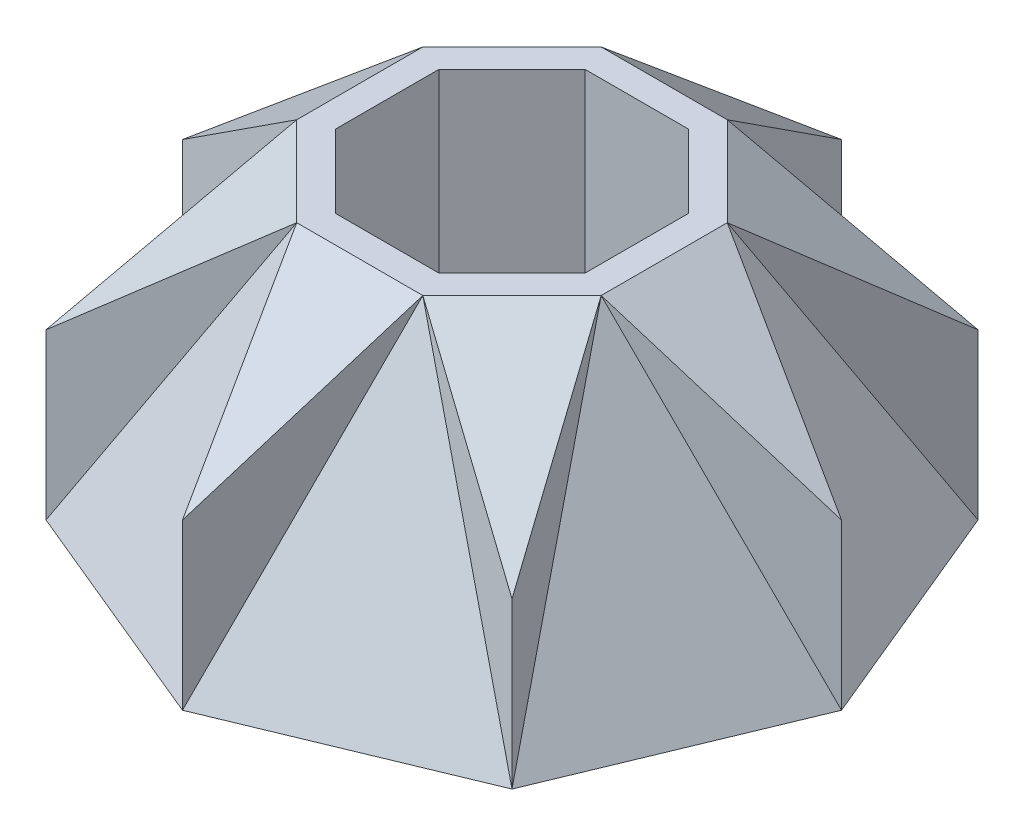
ISO-10303-21;
HEADER;
FILE_DESCRIPTION(('STEP AP214'),'2;1');
FILE_NAME('part.step','',(''),(''),'','','');
FILE_SCHEMA(('AUTOMOTIVE_DESIGN { 1 0 10303 214 1 1 1 1 }'));
ENDSEC;
DATA;
#1=APPLICATION_CONTEXT('core data for automotive mechanical design processes');
#2=APPLICATION_PROTOCOL_DEFINITION('international standard','automotive_design',2000,#1);
#3=PRODUCT_CONTEXT('',#1,'mechanical');
#4=PRODUCT('Part','Part','',(#3));
#5=PRODUCT_RELATED_PRODUCT_CATEGORY('part','',(#4));
#6=PRODUCT_DEFINITION_FORMATION('','',#4);
#7=PRODUCT_DEFINITION_CONTEXT('part definition',#1,'design');
#8=PRODUCT_DEFINITION('design','',#6,#7);
#9=PRODUCT_DEFINITION_SHAPE('','',#8);
#10=(LENGTH_UNIT() NAMED_UNIT(*) SI_UNIT(.MILLI.,.METRE.));
#11=(NAMED_UNIT(*) PLANE_ANGLE_UNIT() SI_UNIT($,.RADIAN.));
#12=(NAMED_UNIT(*) SI_UNIT($,.STERADIAN.) SOLID_ANGLE_UNIT());
#13=UNCERTAINTY_MEASURE_WITH_UNIT(LENGTH_MEASURE(1.E-05),#10,'distance_accuracy_value','');
#14=(GEOMETRIC_REPRESENTATION_CONTEXT(3) GLOBAL_UNCERTAINTY_ASSIGNED_CONTEXT((#13)) GLOBAL_UNIT_ASSIGNED_CONTEXT((#10,
#11,#12)) REPRESENTATION_CONTEXT('',''));
#15=CARTESIAN_POINT('',(0.,0.,0.));
#16=DIRECTION('',(0.,0.,1.));
#17=DIRECTION('',(1.,0.,0.));
#18=AXIS2_PLACEMENT_3D('',#15,#16,#17);
#19=CARTESIAN_POINT('',(0.,55.,0.));
#20=DIRECTION('',(0.,1.,0.));
#21=DIRECTION('',(0.,0.,1.));
#22=AXIS2_PLACEMENT_3D('',#19,#20,#21);
#23=PLANE('',#22);
#24=DIRECTION('',(0.707106781186548,0.,-0.707106781186547));
#25=VECTOR('',#24,1.);
#26=CARTESIAN_POINT('',(9.40943515908719,55.,22.7163859753386));
#27=LINE('',#26,#25);
#28=CARTESIAN_POINT('',(9.40943515908719,55.,22.7163859753386));
#29=VERTEX_POINT('',#28);
#30=CARTESIAN_POINT('',(22.7163859753386,55.,9.4094351590872));
#31=VERTEX_POINT('',#30);
#32=EDGE_CURVE('E78',#29,#31,#27,.T.);
#33=ORIENTED_EDGE('',*,*,#32,.F.);
#34=DIRECTION('',(1.,0.,0.));
#35=VECTOR('',#34,1.);
#36=CARTESIAN_POINT('',(-9.40943515908736,55.,22.7163859753385));
#37=LINE('',#36,#35);
#38=CARTESIAN_POINT('',(-9.40943515908736,55.,22.7163859753385));
#39=VERTEX_POINT('',#38);
#40=EDGE_CURVE('E240',#39,#29,#37,.T.);
#41=ORIENTED_EDGE('',*,*,#40,.F.);
#42=DIRECTION('',(0.707106781186545,0.,0.70710678118655));
#43=VECTOR('',#42,1.);
#44=CARTESIAN_POINT('',(-22.7163859753386,55.,9.40943515908719));
#45=LINE('',#44,#43);
#46=CARTESIAN_POINT('',(-22.7163859753386,55.,9.40943515908719));
#47=VERTEX_POINT('',#46);
#48=EDGE_CURVE('E236',#47,#39,#45,.T.);
#49=ORIENTED_EDGE('',*,*,#48,.F.);
#50=DIRECTION('',(0.,0.,1.));
#51=VECTOR('',#50,1.);
#52=CARTESIAN_POINT('',(-22.7163859753386,55.,-9.40943515908727));
#53=LINE('',#52,#51);
#54=CARTESIAN_POINT('',(-22.7163859753386,55.,-9.40943515908727));
#55=VERTEX_POINT('',#54);
#56=EDGE_CURVE('E232',#55,#47,#53,.T.);
#57=ORIENTED_EDGE('',*,*,#56,.F.);
#58=DIRECTION('',(-0.707106781186553,0.,0.707106781186542));
#59=VECTOR('',#58,1.);
#60=CARTESIAN_POINT('',(-9.40943515908701,55.,-22.7163859753387));
#61=LINE('',#60,#59);
#62=CARTESIAN_POINT('',(-9.40943515908701,55.,-22.7163859753387));
#63=VERTEX_POINT('',#62);
#64=EDGE_CURVE('E225',#63,#55,#61,.T.);
#65=ORIENTED_EDGE('',*,*,#64,.F.);
#66=DIRECTION('',(-1.,0.,0.));
#67=VECTOR('',#66,1.);
#68=CARTESIAN_POINT('',(9.40943515908748,55.,-22.7163859753385));
#69=LINE('',#68,#67);
#70=CARTESIAN_POINT('',(9.40943515908748,55.,-22.7163859753385));
#71=VERTEX_POINT('',#70);
#72=EDGE_CURVE('E221',#71,#63,#69,.T.);
#73=ORIENTED_EDGE('',*,*,#72,.F.);
#74=DIRECTION('',(-0.707106781186539,0.,-0.707106781186556));
#75=VECTOR('',#74,1.);
#76=CARTESIAN_POINT('',(22.7163859753387,55.,-9.40943515908693));
#77=LINE('',#76,#75);
#78=CARTESIAN_POINT('',(22.7163859753387,55.,-9.40943515908693));
#79=VERTEX_POINT('',#78);
#80=EDGE_CURVE('E203',#79,#71,#77,.T.);
#81=ORIENTED_EDGE('',*,*,#80,.F.);
#82=DIRECTION('',(0.,0.,-1.));
#83=VECTOR('',#82,1.);
#84=CARTESIAN_POINT('',(22.7163859753386,55.,9.4094351590872));
#85=LINE('',#84,#83);
#86=EDGE_CURVE('E213',#31,#79,#85,.T.);
#87=ORIENTED_EDGE('',*,*,#86,.F.);
#88=EDGE_LOOP('',(#33,#41,#49,#57,#65,#73,#81,#87));
#89=FACE_BOUND('',#88,.T.);
#90=DIRECTION('',(0.,0.,-1.));
#91=VECTOR('',#90,1.);
#92=CARTESIAN_POINT('',(27.7163859753386,55.,278.893546026037));
#93=LINE('',#92,#91);
#94=CARTESIAN_POINT('',(27.7163859753386,55.,11.4805029709527));
#95=VERTEX_POINT('',#94);
#96=CARTESIAN_POINT('',(27.7163859753387,55.,-11.4805029709524));
#97=VERTEX_POINT('',#96);
#98=EDGE_CURVE('E513',#95,#97,#93,.T.);
#99=ORIENTED_EDGE('',*,*,#98,.T.);
#100=DIRECTION('',(-0.707106781186539,0.,-0.707106781186556));
#101=VECTOR('',#100,1.);
#102=CARTESIAN_POINT('',(232.338970686308,55.,193.142081740021));
#103=LINE('',#102,#101);
#104=CARTESIAN_POINT('',(11.480502970953,55.,-27.7163859753385));
#105=VERTEX_POINT('',#104);
#106=EDGE_CURVE('E247',#97,#105,#103,.T.);
#107=ORIENTED_EDGE('',*,*,#106,.T.);
#108=DIRECTION('',(-1.,0.,0.));
#109=VECTOR('',#108,1.);
#110=CARTESIAN_POINT('',(300.860537437046,55.,-27.7163859753354));
#111=LINE('',#110,#109);
#112=CARTESIAN_POINT('',(-11.4805029709524,55.,-27.7163859753387));
#113=VERTEX_POINT('',#112);
#114=EDGE_CURVE('E279',#105,#113,#111,.T.);
#115=ORIENTED_EDGE('',*,*,#114,.T.);
#116=DIRECTION('',(-0.707106781186554,0.,0.707106781186541));
#117=VECTOR('',#116,1.);
#118=CARTESIAN_POINT('',(193.142081740021,55.,-232.338970686308));
#119=LINE('',#118,#117);
#120=CARTESIAN_POINT('',(-27.7163859753387,55.,-11.4805029709528));
#121=VERTEX_POINT('',#120);
#122=EDGE_CURVE('E297',#113,#121,#119,.T.);
#123=ORIENTED_EDGE('',*,*,#122,.T.);
#124=DIRECTION('',(0.,0.,1.));
#125=VECTOR('',#124,1.);
#126=CARTESIAN_POINT('',(-27.7163859753386,55.,-300.860537437046));
#127=LINE('',#126,#125);
#128=CARTESIAN_POINT('',(-27.7163859753386,55.,11.4805029709527));
#129=VERTEX_POINT('',#128);
#130=EDGE_CURVE('E315',#121,#129,#127,.T.);
#131=ORIENTED_EDGE('',*,*,#130,.T.);
#132=DIRECTION('',(0.707106781186544,0.,0.707106781186551));
#133=VECTOR('',#132,1.);
#134=CARTESIAN_POINT('',(-232.338970686309,55.,-193.14208174002));
#135=LINE('',#134,#133);
#136=CARTESIAN_POINT('',(-11.4805029709529,55.,27.7163859753385));
#137=VERTEX_POINT('',#136);
#138=EDGE_CURVE('E333',#129,#137,#135,.T.);
#139=ORIENTED_EDGE('',*,*,#138,.T.);
#140=DIRECTION('',(1.,0.,0.));
#141=VECTOR('',#140,1.);
#142=CARTESIAN_POINT('',(-300.860537437046,55.,27.7163859753375));
#143=LINE('',#142,#141);
#144=CARTESIAN_POINT('',(11.4805029709527,55.,27.7163859753386));
#145=VERTEX_POINT('',#144);
#146=EDGE_CURVE('E351',#137,#145,#143,.T.);
#147=ORIENTED_EDGE('',*,*,#146,.T.);
#148=DIRECTION('',(0.707106781186549,0.,-0.707106781186546));
#149=VECTOR('',#148,1.);
#150=CARTESIAN_POINT('',(-193.142081740019,55.,232.33897068631));
#151=LINE('',#150,#149);
#152=EDGE_CURVE('E369',#145,#95,#151,.T.);
#153=ORIENTED_EDGE('',*,*,#152,.T.);
#154=EDGE_LOOP('',(#99,#107,#115,#123,#131,#139,#147,#153));
#155=FACE_BOUND('',#154,.T.);
#156=ADVANCED_FACE('F61',(#89,#155),#23,.T.);
#157=CARTESIAN_POINT('',(11.480502970953,-0.002000000000002,-27.7163859753385));
#158=DIRECTION('',(-0.429311983438382,0.,-0.903156254961566));
#159=DIRECTION('',(-0.903156254961566,0.,0.429311983438382));
#160=AXIS2_PLACEMENT_3D('',#157,#158,#159);
#161=PLANE('',#160);
#162=DIRECTION('',(0.477560604595581,-0.848766070541332,-0.227006666060998));
#163=VECTOR('',#162,1.);
#164=CARTESIAN_POINT('',(33.774861724865,15.3763478546955,-38.3139269031108));
#165=LINE('',#164,#163);
#166=CARTESIAN_POINT('',(42.4264068711934,4.07746753028349E-12,-42.4264068711923));
#167=VERTEX_POINT('',#166);
#168=EDGE_CURVE('E403',#105,#167,#165,.T.);
#169=ORIENTED_EDGE('',*,*,#168,.F.);
#170=DIRECTION('',(0.729597815885047,-0.58941388352804,-0.346811621720154));
#171=VECTOR('',#170,1.);
#172=CARTESIAN_POINT('',(35.1332925552082,35.8918252472895,-38.9596519710984));
#173=LINE('',#172,#171);
#174=CARTESIAN_POINT('',(42.4264068711934,30.,-42.4264068711923));
#175=VERTEX_POINT('',#174);
#176=EDGE_CURVE('E273',#105,#175,#173,.T.);
#177=ORIENTED_EDGE('',*,*,#176,.T.);
#178=DIRECTION('',(0.,1.,0.));
#179=VECTOR('',#178,1.);
#180=CARTESIAN_POINT('',(42.4264068711934,-0.002000000000002,-42.4264068711923));
#181=LINE('',#180,#179);
#182=EDGE_CURVE('E387',#167,#175,#181,.T.);
#183=ORIENTED_EDGE('',*,*,#182,.F.);
#184=EDGE_LOOP('',(#169,#177,#183));
#185=FACE_BOUND('',#184,.T.);
#186=ADVANCED_FACE('F675',(#185),#161,.T.);
#187=CARTESIAN_POINT('',(42.4264068711934,-0.002000000000002,-42.4264068711923));
#188=DIRECTION('',(0.903156254961556,0.,0.429311983438405));
#189=DIRECTION('',(0.429311983438405,0.,-0.903156254961556));
#190=AXIS2_PLACEMENT_3D('',#187,#188,#189);
#191=PLANE('',#190);
#192=ORIENTED_EDGE('',*,*,#182,.T.);
#193=DIRECTION('',(-0.346811621720172,0.58941388352804,0.729597815885038));
#194=VECTOR('',#193,1.);
#195=CARTESIAN_POINT('',(48.5592832466853,19.5770433996796,-55.3283194035878));
#196=LINE('',#195,#194);
#197=EDGE_CURVE('E269',#175,#97,#196,.T.);
#198=ORIENTED_EDGE('',*,*,#197,.T.);
#199=DIRECTION('',(-0.227006666061007,0.848766070541338,0.477560604595568));
#200=VECTOR('',#199,1.);
#201=CARTESIAN_POINT('',(42.4267922223051,-0.0014408076851852,-42.4272175456677));
#202=LINE('',#201,#200);
#203=EDGE_CURVE('E395',#167,#97,#202,.T.);
#204=ORIENTED_EDGE('',*,*,#203,.F.);
#205=EDGE_LOOP('',(#192,#198,#204));
#206=FACE_BOUND('',#205,.T.);
#207=ADVANCED_FACE('F733',(#206),#191,.T.);
#208=CARTESIAN_POINT('',(-11.4805029709524,-0.002000000000002,-27.7163859753387));
#209=DIRECTION('',(-0.942197327088298,0.,-0.335058497620442));
#210=DIRECTION('',(-0.335058497620442,0.,0.942197327088298));
#211=AXIS2_PLACEMENT_3D('',#208,#209,#210);
#212=PLANE('',#211);
#213=DIRECTION('',(0.1771683889908,-0.848766070541333,-0.498204294883365));
#214=VECTOR('',#213,1.);
#215=CARTESIAN_POINT('',(-3.20960376778544,15.3763478546954,-50.9744712863654));
#216=LINE('',#215,#214);
#217=CARTESIAN_POINT('',(6.39209206167128E-13,3.41480316246034E-12,-60.));
#218=VERTEX_POINT('',#217);
#219=EDGE_CURVE('E421',#113,#218,#216,.T.);
#220=ORIENTED_EDGE('',*,*,#219,.F.);
#221=DIRECTION('',(0.270670713638586,-0.58941388352804,-0.761136412663836));
#222=VECTOR('',#221,1.);
#223=CARTESIAN_POINT('',(-2.70564469023309,35.8918252472895,-52.3916235126301));
#224=LINE('',#223,#222);
#225=CARTESIAN_POINT('',(6.22765727875674E-13,30.,-60.));
#226=VERTEX_POINT('',#225);
#227=EDGE_CURVE('E291',#113,#226,#224,.T.);
#228=ORIENTED_EDGE('',*,*,#227,.T.);
#229=DIRECTION('',(0.,1.,0.));
#230=VECTOR('',#229,1.);
#231=CARTESIAN_POINT('',(6.39209206167128E-13,-0.002000000000002,-60.));
#232=LINE('',#231,#230);
#233=EDGE_CURVE('E407',#218,#226,#232,.T.);
#234=ORIENTED_EDGE('',*,*,#233,.F.);
#235=EDGE_LOOP('',(#220,#228,#234));
#236=FACE_BOUND('',#235,.T.);
#237=ADVANCED_FACE('F730',(#236),#212,.T.);
#238=CARTESIAN_POINT('',(6.39209206167128E-13,-0.002000000000002,-60.));
#239=DIRECTION('',(0.942197327088305,0.,-0.335058497620421));
#240=DIRECTION('',(-0.335058497620421,0.,-0.942197327088305));
#241=AXIS2_PLACEMENT_3D('',#238,#239,#240);
#242=PLANE('',#241);
#243=ORIENTED_EDGE('',*,*,#233,.T.);
#244=DIRECTION('',(0.270670713638569,0.58941388352804,0.761136412663842));
#245=VECTOR('',#244,1.);
#246=CARTESIAN_POINT('',(-4.78643136864277,19.5770433996796,-73.4596283152216));
#247=LINE('',#246,#245);
#248=EDGE_CURVE('E287',#226,#105,#247,.T.);
#249=ORIENTED_EDGE('',*,*,#248,.T.);
#250=DIRECTION('',(0.177168388990786,0.848766070541337,0.498204294883361));
#251=VECTOR('',#250,1.);
#252=CARTESIAN_POINT('',(-0.000300749033970873,-0.00144080768516555,-60.0008457178031));
#253=LINE('',#252,#251);
#254=EDGE_CURVE('E413',#218,#105,#253,.T.);
#255=ORIENTED_EDGE('',*,*,#254,.F.);
#256=EDGE_LOOP('',(#243,#249,#255));
#257=FACE_BOUND('',#256,.T.);
#258=ADVANCED_FACE('F725',(#257),#242,.T.);
#259=CARTESIAN_POINT('',(-27.7163859753385,-0.002000000000002,-11.4805029709529));
#260=DIRECTION('',(-0.903156254961565,0.,0.429311983438386));
#261=DIRECTION('',(0.429311983438385,0.,0.903156254961565));
#262=AXIS2_PLACEMENT_3D('',#259,#260,#261);
#263=PLANE('',#262);
#264=DIRECTION('',(-0.227006666060999,-0.848766070541333,-0.477560604595579));
#265=VECTOR('',#264,1.);
#266=CARTESIAN_POINT('',(-38.3139269031109,15.3763478546954,-33.7748617248649));
#267=LINE('',#266,#265);
#268=CARTESIAN_POINT('',(-42.4264068711925,2.30978430826312E-12,-42.4264068711932));
#269=VERTEX_POINT('',#268);
#270=EDGE_CURVE('E439',#121,#269,#267,.T.);
#271=ORIENTED_EDGE('',*,*,#270,.F.);
#272=DIRECTION('',(-0.346811621720156,-0.58941388352804,-0.729597815885046));
#273=VECTOR('',#272,1.);
#274=CARTESIAN_POINT('',(-38.9596519710985,35.8918252472895,-35.133292555208));
#275=LINE('',#274,#273);
#276=CARTESIAN_POINT('',(-42.4264068711925,30.,-42.4264068711932));
#277=VERTEX_POINT('',#276);
#278=EDGE_CURVE('E309',#121,#277,#275,.T.);
#279=ORIENTED_EDGE('',*,*,#278,.T.);
#280=DIRECTION('',(0.,1.,0.));
#281=VECTOR('',#280,1.);
#282=CARTESIAN_POINT('',(-42.4264068711925,-0.002000000000002,-42.4264068711932));
#283=LINE('',#282,#281);
#284=EDGE_CURVE('E425',#269,#277,#283,.T.);
#285=ORIENTED_EDGE('',*,*,#284,.F.);
#286=EDGE_LOOP('',(#271,#279,#285));
#287=FACE_BOUND('',#286,.T.);
#288=ADVANCED_FACE('F722',(#287),#263,.T.);
#289=CARTESIAN_POINT('',(-42.4264068711925,-0.002000000000002,-42.4264068711932));
#290=DIRECTION('',(0.429311983438402,0.,-0.903156254961557));
#291=DIRECTION('',(-0.903156254961557,0.,-0.429311983438402));
#292=AXIS2_PLACEMENT_3D('',#289,#290,#291);
#293=PLANE('',#292);
#294=ORIENTED_EDGE('',*,*,#284,.T.);
#295=DIRECTION('',(0.72959781588504,0.58941388352804,0.34681162172017));
#296=VECTOR('',#295,1.);
#297=CARTESIAN_POINT('',(-55.3283194035879,19.5770433996796,-48.5592832466851));
#298=LINE('',#297,#296);
#299=EDGE_CURVE('E305',#277,#113,#298,.T.);
#300=ORIENTED_EDGE('',*,*,#299,.T.);
#301=DIRECTION('',(0.477560604595569,0.848766070541337,0.227006666061005));
#302=VECTOR('',#301,1.);
#303=CARTESIAN_POINT('',(-42.4272175456679,-0.00144080768515214,-42.426792222305));
#304=LINE('',#303,#302);
#305=EDGE_CURVE('E431',#269,#113,#304,.T.);
#306=ORIENTED_EDGE('',*,*,#305,.F.);
#307=EDGE_LOOP('',(#294,#300,#306));
#308=FACE_BOUND('',#307,.T.);
#309=ADVANCED_FACE('F717',(#308),#293,.T.);
#310=CARTESIAN_POINT('',(-27.7163859753386,-0.002000000000002,11.4805029709527));
#311=DIRECTION('',(-0.335058497620432,0.,0.942197327088301));
#312=DIRECTION('',(0.942197327088301,0.,0.335058497620432));
#313=AXIS2_PLACEMENT_3D('',#310,#311,#312);
#314=PLANE('',#313);
#315=DIRECTION('',(-0.498204294883363,-0.848766070541335,-0.177168388990794));
#316=VECTOR('',#315,1.);
#317=CARTESIAN_POINT('',(-50.9744712863653,15.3763478546952,3.209603767786));
#318=LINE('',#317,#316);
#319=CARTESIAN_POINT('',(-60.,1.60461921527855E-13,0.));
#320=VERTEX_POINT('',#319);
#321=EDGE_CURVE('E457',#129,#320,#318,.T.);
#322=ORIENTED_EDGE('',*,*,#321,.F.);
#323=DIRECTION('',(-0.761136412663839,-0.58941388352804,-0.270670713638577));
#324=VECTOR('',#323,1.);
#325=CARTESIAN_POINT('',(-52.39162351263,35.8918252472895,2.70564469023364));
#326=LINE('',#325,#324);
#327=CARTESIAN_POINT('',(-60.,30.,0.));
#328=VERTEX_POINT('',#327);
#329=EDGE_CURVE('E327',#129,#328,#326,.T.);
#330=ORIENTED_EDGE('',*,*,#329,.T.);
#331=DIRECTION('',(0.,1.,0.));
#332=VECTOR('',#331,1.);
#333=CARTESIAN_POINT('',(-60.,-0.002000000000002,0.));
#334=LINE('',#333,#332);
#335=EDGE_CURVE('E443',#320,#328,#334,.T.);
#336=ORIENTED_EDGE('',*,*,#335,.F.);
#337=EDGE_LOOP('',(#322,#330,#336));
#338=FACE_BOUND('',#337,.T.);
#339=ADVANCED_FACE('F714',(#338),#314,.T.);
#340=CARTESIAN_POINT('',(-60.,-0.002000000000002,0.));
#341=DIRECTION('',(-0.33505849762043,0.,-0.942197327088302));
#342=DIRECTION('',(-0.942197327088302,0.,0.33505849762043));
#343=AXIS2_PLACEMENT_3D('',#340,#341,#342);
#344=PLANE('',#343);
#345=ORIENTED_EDGE('',*,*,#335,.T.);
#346=DIRECTION('',(0.761136412663839,0.58941388352804,-0.270670713638577));
#347=VECTOR('',#346,1.);
#348=CARTESIAN_POINT('',(-73.4596283152216,19.5770433996796,4.78643136864354));
#349=LINE('',#348,#347);
#350=EDGE_CURVE('E323',#328,#121,#349,.T.);
#351=ORIENTED_EDGE('',*,*,#350,.T.);
#352=DIRECTION('',(0.498204294883363,0.848766070541335,-0.177168388990793));
#353=VECTOR('',#352,1.);
#354=CARTESIAN_POINT('',(-60.0008457178034,-0.00144080768500434,0.000300749034686051));
#355=LINE('',#354,#353);
#356=EDGE_CURVE('E449',#320,#121,#355,.T.);
#357=ORIENTED_EDGE('',*,*,#356,.F.);
#358=EDGE_LOOP('',(#345,#351,#357));
#359=FACE_BOUND('',#358,.T.);
#360=ADVANCED_FACE('F709',(#359),#344,.T.);
#361=CARTESIAN_POINT('',(-11.4805029709528,-0.002000000000002,27.7163859753385));
#362=DIRECTION('',(0.429311983438389,0.,0.903156254961563));
#363=DIRECTION('',(0.903156254961563,0.,-0.429311983438389));
#364=AXIS2_PLACEMENT_3D('',#361,#362,#363);
#365=PLANE('',#364);
#366=DIRECTION('',(-0.477560604595578,-0.848766070541333,0.227006666061001));
#367=VECTOR('',#366,1.);
#368=CARTESIAN_POINT('',(-33.7748617248647,15.3763478546953,38.313926903111));
#369=LINE('',#368,#367);
#370=CARTESIAN_POINT('',(-42.4264068711931,2.48759346455074E-12,42.4264068711926));
#371=VERTEX_POINT('',#370);
#372=EDGE_CURVE('E475',#137,#371,#369,.T.);
#373=ORIENTED_EDGE('',*,*,#372,.F.);
#374=DIRECTION('',(-0.729597815885045,-0.58941388352804,0.346811621720159));
#375=VECTOR('',#374,1.);
#376=CARTESIAN_POINT('',(-35.1332925552079,35.8918252472895,38.9596519710987));
#377=LINE('',#376,#375);
#378=CARTESIAN_POINT('',(-42.4264068711931,30.,42.4264068711926));
#379=VERTEX_POINT('',#378);
#380=EDGE_CURVE('E345',#137,#379,#377,.T.);
#381=ORIENTED_EDGE('',*,*,#380,.T.);
#382=DIRECTION('',(0.,1.,0.));
#383=VECTOR('',#382,1.);
#384=CARTESIAN_POINT('',(-42.4264068711931,-0.002000000000002,42.4264068711926));
#385=LINE('',#384,#383);
#386=EDGE_CURVE('E461',#371,#379,#385,.T.);
#387=ORIENTED_EDGE('',*,*,#386,.F.);
#388=EDGE_LOOP('',(#373,#381,#387));
#389=FACE_BOUND('',#388,.T.);
#390=ADVANCED_FACE('F706',(#389),#365,.T.);
#391=CARTESIAN_POINT('',(-42.4264068711931,-0.002000000000002,42.4264068711926));
#392=DIRECTION('',(-0.903156254961558,0.,-0.429311983438399));
#393=DIRECTION('',(-0.429311983438399,0.,0.903156254961558));
#394=AXIS2_PLACEMENT_3D('',#391,#392,#393);
#395=PLANE('',#394);
#396=ORIENTED_EDGE('',*,*,#386,.T.);
#397=DIRECTION('',(0.346811621720167,0.58941388352804,-0.729597815885041));
#398=VECTOR('',#397,1.);
#399=CARTESIAN_POINT('',(-48.5592832466849,19.5770433996796,55.3283194035881));
#400=LINE('',#399,#398);
#401=EDGE_CURVE('E341',#379,#129,#400,.T.);
#402=ORIENTED_EDGE('',*,*,#401,.T.);
#403=DIRECTION('',(0.227006666061004,0.848766070541336,-0.477560604595571));
#404=VECTOR('',#403,1.);
#405=CARTESIAN_POINT('',(-42.4267922223049,-0.00144080768507541,42.4272175456681));
#406=LINE('',#405,#404);
#407=EDGE_CURVE('E467',#371,#129,#406,.T.);
#408=ORIENTED_EDGE('',*,*,#407,.F.);
#409=EDGE_LOOP('',(#396,#402,#408));
#410=FACE_BOUND('',#409,.T.);
#411=ADVANCED_FACE('F701',(#410),#395,.T.);
#412=CARTESIAN_POINT('',(11.4805029709526,-0.002000000000002,27.7163859753386));
#413=DIRECTION('',(0.9421973270883,0.,0.335058497620435));
#414=DIRECTION('',(0.335058497620435,0.,-0.9421973270883));
#415=AXIS2_PLACEMENT_3D('',#412,#413,#414);
#416=PLANE('',#415);
#417=DIRECTION('',(-0.177168388990796,-0.848766070541334,0.498204294883364));
#418=VECTOR('',#417,1.);
#419=CARTESIAN_POINT('',(3.20960376778581,15.3763478546953,50.9744712863653));
#420=LINE('',#419,#418);
#421=CARTESIAN_POINT('',(-2.20231445505952E-13,1.98539101825546E-12,60.));
#422=VERTEX_POINT('',#421);
#423=EDGE_CURVE('E493',#145,#422,#420,.T.);
#424=ORIENTED_EDGE('',*,*,#423,.F.);
#425=DIRECTION('',(-0.27067071363858,-0.58941388352804,0.761136412663838));
#426=VECTOR('',#425,1.);
#427=CARTESIAN_POINT('',(2.70564469023346,35.8918252472895,52.39162351263));
#428=LINE('',#427,#426);
#429=CARTESIAN_POINT('',(-2.21610924056037E-13,30.,60.));
#430=VERTEX_POINT('',#429);
#431=EDGE_CURVE('E363',#145,#430,#428,.T.);
#432=ORIENTED_EDGE('',*,*,#431,.T.);
#433=DIRECTION('',(0.,1.,0.));
#434=VECTOR('',#433,1.);
#435=CARTESIAN_POINT('',(-2.20231445505952E-13,-0.002000000000002,60.));
#436=LINE('',#435,#434);
#437=EDGE_CURVE('E479',#422,#430,#436,.T.);
#438=ORIENTED_EDGE('',*,*,#437,.F.);
#439=EDGE_LOOP('',(#424,#432,#438));
#440=FACE_BOUND('',#439,.T.);
#441=ADVANCED_FACE('F698',(#440),#416,.T.);
#442=CARTESIAN_POINT('',(-2.20231445505952E-13,-0.002000000000002,60.));
#443=DIRECTION('',(-0.942197327088303,0.,0.335058497620427));
#444=DIRECTION('',(0.335058497620427,0.,0.942197327088303));
#445=AXIS2_PLACEMENT_3D('',#442,#443,#444);
#446=PLANE('',#445);
#447=ORIENTED_EDGE('',*,*,#437,.T.);
#448=DIRECTION('',(-0.270670713638574,0.58941388352804,-0.76113641266384));
#449=VECTOR('',#448,1.);
#450=CARTESIAN_POINT('',(4.78643136864328,19.5770433996796,73.4596283152216));
#451=LINE('',#450,#449);
#452=EDGE_CURVE('E359',#430,#137,#451,.T.);
#453=ORIENTED_EDGE('',*,*,#452,.T.);
#454=DIRECTION('',(-0.177168388990791,0.848766070541336,-0.498204294883362));
#455=VECTOR('',#454,1.);
#456=CARTESIAN_POINT('',(0.000300749034441443,-0.00144080768506963,60.0008457178033));
#457=LINE('',#456,#455);
#458=EDGE_CURVE('E485',#422,#137,#457,.T.);
#459=ORIENTED_EDGE('',*,*,#458,.F.);
#460=EDGE_LOOP('',(#447,#453,#459));
#461=FACE_BOUND('',#460,.T.);
#462=ADVANCED_FACE('F693',(#461),#446,.T.);
#463=CARTESIAN_POINT('',(27.7163859753386,-0.002000000000002,11.4805029709527));
#464=DIRECTION('',(0.903156254961562,0.,-0.429311983438392));
#465=DIRECTION('',(-0.429311983438392,0.,-0.903156254961562));
#466=AXIS2_PLACEMENT_3D('',#463,#464,#465);
#467=PLANE('',#466);
#468=DIRECTION('',(0.227006666061002,-0.848766070541334,0.477560604595575));
#469=VECTOR('',#468,1.);
#470=CARTESIAN_POINT('',(38.3139269031112,15.3763478546953,33.7748617248646));
#471=LINE('',#470,#469);
#472=CARTESIAN_POINT('',(42.4264068711928,1.42458236233965E-13,42.4264068711929));
#473=VERTEX_POINT('',#472);
#474=EDGE_CURVE('E509',#95,#473,#471,.T.);
#475=ORIENTED_EDGE('',*,*,#474,.F.);
#476=DIRECTION('',(0.346811621720161,-0.58941388352804,0.729597815885044));
#477=VECTOR('',#476,1.);
#478=CARTESIAN_POINT('',(38.9596519710988,35.8918252472895,35.1332925552077));
#479=LINE('',#478,#477);
#480=CARTESIAN_POINT('',(42.4264068711928,30.,42.4264068711929));
#481=VERTEX_POINT('',#480);
#482=EDGE_CURVE('E381',#95,#481,#479,.T.);
#483=ORIENTED_EDGE('',*,*,#482,.T.);
#484=DIRECTION('',(0.,1.,0.));
#485=VECTOR('',#484,1.);
#486=CARTESIAN_POINT('',(42.4264068711928,-0.002000000000002,42.4264068711929));
#487=LINE('',#486,#485);
#488=EDGE_CURVE('E497',#473,#481,#487,.T.);
#489=ORIENTED_EDGE('',*,*,#488,.F.);
#490=EDGE_LOOP('',(#475,#483,#489));
#491=FACE_BOUND('',#490,.T.);
#492=ADVANCED_FACE('F690',(#491),#467,.T.);
#493=CARTESIAN_POINT('',(42.4264068711928,-0.002000000000002,42.4264068711929));
#494=DIRECTION('',(-0.429311983438396,0.,0.90315625496156));
#495=DIRECTION('',(0.90315625496156,0.,0.429311983438396));
#496=AXIS2_PLACEMENT_3D('',#493,#494,#495);
#497=PLANE('',#496);
#498=ORIENTED_EDGE('',*,*,#488,.T.);
#499=DIRECTION('',(-0.729597815885042,0.58941388352804,-0.346811621720165));
#500=VECTOR('',#499,1.);
#501=CARTESIAN_POINT('',(55.3283194035883,19.5770433996796,48.5592832466847));
#502=LINE('',#501,#500);
#503=EDGE_CURVE('E377',#481,#145,#502,.T.);
#504=ORIENTED_EDGE('',*,*,#503,.T.);
#505=DIRECTION('',(-0.477560604595573,0.848766070541335,-0.227006666061003));
#506=VECTOR('',#505,1.);
#507=CARTESIAN_POINT('',(42.4272175456683,-0.00144080768503121,42.4267922223048));
#508=LINE('',#507,#506);
#509=EDGE_CURVE('E503',#473,#145,#508,.T.);
#510=ORIENTED_EDGE('',*,*,#509,.F.);
#511=EDGE_LOOP('',(#498,#504,#510));
#512=FACE_BOUND('',#511,.T.);
#513=ADVANCED_FACE('F680',(#512),#497,.T.);
#514=CARTESIAN_POINT('',(27.7163859753386,-0.002000000000002,-11.4805029709527));
#515=DIRECTION('',(0.335058497620432,0.,-0.942197327088301));
#516=DIRECTION('',(-0.942197327088301,0.,-0.335058497620432));
#517=AXIS2_PLACEMENT_3D('',#514,#515,#516);
#518=PLANE('',#517);
#519=DIRECTION('',(0.498204294883363,-0.848766070541335,0.177168388990794));
#520=VECTOR('',#519,1.);
#521=CARTESIAN_POINT('',(50.9744712863652,15.3763478546952,-3.20960376778601));
#522=LINE('',#521,#520);
#523=CARTESIAN_POINT('',(60.,0.,0.));
#524=VERTEX_POINT('',#523);
#525=EDGE_CURVE('E537',#97,#524,#522,.T.);
#526=ORIENTED_EDGE('',*,*,#525,.F.);
#527=DIRECTION('',(0.761136412663839,-0.58941388352804,0.270670713638577));
#528=VECTOR('',#527,1.);
#529=CARTESIAN_POINT('',(52.39162351263,35.8918252472895,-2.70564469023364));
#530=LINE('',#529,#528);
#531=CARTESIAN_POINT('',(60.,30.,0.));
#532=VERTEX_POINT('',#531);
#533=EDGE_CURVE('E519',#97,#532,#530,.T.);
#534=ORIENTED_EDGE('',*,*,#533,.T.);
#535=DIRECTION('',(0.,1.,0.));
#536=VECTOR('',#535,1.);
#537=CARTESIAN_POINT('',(60.,-0.002000000000002,0.));
#538=LINE('',#537,#536);
#539=EDGE_CURVE('E523',#524,#532,#538,.T.);
#540=ORIENTED_EDGE('',*,*,#539,.F.);
#541=EDGE_LOOP('',(#526,#534,#540));
#542=FACE_BOUND('',#541,.T.);
#543=ADVANCED_FACE('F676',(#542),#518,.T.);
#544=CARTESIAN_POINT('',(60.,-0.002000000000002,0.));
#545=DIRECTION('',(0.33505849762043,0.,0.942197327088302));
#546=DIRECTION('',(0.942197327088302,0.,-0.33505849762043));
#547=AXIS2_PLACEMENT_3D('',#544,#545,#546);
#548=PLANE('',#547);
#549=ORIENTED_EDGE('',*,*,#539,.T.);
#550=DIRECTION('',(-0.761136412663839,0.58941388352804,0.270670713638576));
#551=VECTOR('',#550,1.);
#552=CARTESIAN_POINT('',(73.4596283152216,19.5770433996796,-4.78643136864354));
#553=LINE('',#552,#551);
#554=EDGE_CURVE('E824',#532,#95,#553,.T.);
#555=ORIENTED_EDGE('',*,*,#554,.T.);
#556=DIRECTION('',(-0.498204294883363,0.848766070541335,0.177168388990793));
#557=VECTOR('',#556,1.);
#558=CARTESIAN_POINT('',(60.0008457178034,-0.00144080768498989,-0.00030074903469382));
#559=LINE('',#558,#557);
#560=EDGE_CURVE('E531',#524,#95,#559,.T.);
#561=ORIENTED_EDGE('',*,*,#560,.F.);
#562=EDGE_LOOP('',(#549,#555,#561));
#563=FACE_BOUND('',#562,.T.);
#564=ADVANCED_FACE('F679',(#563),#548,.T.);
#565=CARTESIAN_POINT('',(0.,0.,0.));
#566=DIRECTION('',(0.,1.,0.));
#567=DIRECTION('',(0.,0.,1.));
#568=AXIS2_PLACEMENT_3D('',#565,#566,#567);
#569=PLANE('',#568);
#570=DIRECTION('',(1.,0.,0.));
#571=VECTOR('',#570,1.);
#572=CARTESIAN_POINT('',(-1.17263802394765E-13,0.,22.7163859753386));
#573=LINE('',#572,#571);
#574=CARTESIAN_POINT('',(-9.40943515908736,0.,22.7163859753385));
#575=VERTEX_POINT('',#574);
#576=CARTESIAN_POINT('',(9.40943515908719,0.,22.7163859753386));
#577=VERTEX_POINT('',#576);
#578=EDGE_CURVE('E71',#575,#577,#573,.T.);
#579=ORIENTED_EDGE('',*,*,#578,.T.);
#580=DIRECTION('',(0.707106781186548,0.,-0.707106781186547));
#581=VECTOR('',#580,1.);
#582=CARTESIAN_POINT('',(16.0629105672129,0.,16.0629105672129));
#583=LINE('',#582,#581);
#584=CARTESIAN_POINT('',(22.7163859753386,0.,9.4094351590872));
#585=VERTEX_POINT('',#584);
#586=EDGE_CURVE('E12',#577,#585,#583,.T.);
#587=ORIENTED_EDGE('',*,*,#586,.T.);
#588=DIRECTION('',(0.,0.,-1.));
#589=VECTOR('',#588,1.);
#590=CARTESIAN_POINT('',(22.7163859753387,0.,1.04699823566757E-13));
#591=LINE('',#590,#589);
#592=CARTESIAN_POINT('',(22.7163859753387,0.,-9.40943515908693));
#593=VERTEX_POINT('',#592);
#594=EDGE_CURVE('E818',#585,#593,#591,.T.);
#595=ORIENTED_EDGE('',*,*,#594,.T.);
#596=DIRECTION('',(-0.707106781186539,0.,-0.707106781186556));
#597=VECTOR('',#596,1.);
#598=CARTESIAN_POINT('',(16.0629105672131,0.,-16.0629105672127));
#599=LINE('',#598,#597);
#600=CARTESIAN_POINT('',(9.40943515908748,0.,-22.7163859753385));
#601=VERTEX_POINT('',#600);
#602=EDGE_CURVE('E206',#593,#601,#599,.T.);
#603=ORIENTED_EDGE('',*,*,#602,.T.);
#604=DIRECTION('',(-1.,0.,0.));
#605=VECTOR('',#604,1.);
#606=CARTESIAN_POINT('',(2.2615161890419E-13,0.,-22.7163859753386));
#607=LINE('',#606,#605);
#608=CARTESIAN_POINT('',(-9.40943515908701,0.,-22.7163859753387));
#609=VERTEX_POINT('',#608);
#610=EDGE_CURVE('E815',#601,#609,#607,.T.);
#611=ORIENTED_EDGE('',*,*,#610,.T.);
#612=DIRECTION('',(-0.707106781186553,0.,0.707106781186542));
#613=VECTOR('',#612,1.);
#614=CARTESIAN_POINT('',(-16.0629105672128,0.,-16.062910567213));
#615=LINE('',#614,#613);
#616=CARTESIAN_POINT('',(-22.7163859753386,0.,-9.40943515908727));
#617=VERTEX_POINT('',#616);
#618=EDGE_CURVE('E813',#609,#617,#615,.T.);
#619=ORIENTED_EDGE('',*,*,#618,.T.);
#620=DIRECTION('',(0.,0.,1.));
#621=VECTOR('',#620,1.);
#622=CARTESIAN_POINT('',(-22.7163859753386,0.,0.));
#623=LINE('',#622,#621);
#624=CARTESIAN_POINT('',(-22.7163859753386,0.,9.40943515908719));
#625=VERTEX_POINT('',#624);
#626=EDGE_CURVE('E810',#617,#625,#623,.T.);
#627=ORIENTED_EDGE('',*,*,#626,.T.);
#628=DIRECTION('',(0.707106781186545,0.,0.70710678118655));
#629=VECTOR('',#628,1.);
#630=CARTESIAN_POINT('',(-16.062910567213,0.,16.0629105672129));
#631=LINE('',#630,#629);
#632=EDGE_CURVE('E832',#625,#575,#631,.T.);
#633=ORIENTED_EDGE('',*,*,#632,.T.);
#634=EDGE_LOOP('',(#579,#587,#595,#603,#611,#619,#627,#633));
#635=FACE_BOUND('',#634,.T.);
#636=DIRECTION('',(-0.923879532511287,0.,-0.38268343236509));
#637=VECTOR('',#636,1.);
#638=CARTESIAN_POINT('',(42.4264068711929,0.,-42.4264068711928));
#639=LINE('',#638,#637);
#640=EDGE_CURVE('E541',#167,#218,#639,.T.);
#641=ORIENTED_EDGE('',*,*,#640,.F.);
#642=DIRECTION('',(-0.38268343236509,0.,-0.923879532511287));
#643=VECTOR('',#642,1.);
#644=CARTESIAN_POINT('',(60.,0.,0.));
#645=LINE('',#644,#643);
#646=EDGE_CURVE('E546',#524,#167,#645,.T.);
#647=ORIENTED_EDGE('',*,*,#646,.F.);
#648=DIRECTION('',(0.38268343236509,0.,-0.923879532511287));
#649=VECTOR('',#648,1.);
#650=CARTESIAN_POINT('',(42.4264068711929,0.,42.4264068711928));
#651=LINE('',#650,#649);
#652=EDGE_CURVE('E854',#473,#524,#651,.T.);
#653=ORIENTED_EDGE('',*,*,#652,.F.);
#654=DIRECTION('',(0.923879532511287,0.,-0.38268343236509));
#655=VECTOR('',#654,1.);
#656=CARTESIAN_POINT('',(0.,0.,60.));
#657=LINE('',#656,#655);
#658=EDGE_CURVE('E588',#422,#473,#657,.T.);
#659=ORIENTED_EDGE('',*,*,#658,.F.);
#660=DIRECTION('',(0.923879532511287,0.,0.38268343236509));
#661=VECTOR('',#660,1.);
#662=CARTESIAN_POINT('',(-42.4264068711929,0.,42.4264068711928));
#663=LINE('',#662,#661);
#664=EDGE_CURVE('E601',#371,#422,#663,.T.);
#665=ORIENTED_EDGE('',*,*,#664,.F.);
#666=DIRECTION('',(0.38268343236509,0.,0.923879532511287));
#667=VECTOR('',#666,1.);
#668=CARTESIAN_POINT('',(-60.,0.,0.));
#669=LINE('',#668,#667);
#670=EDGE_CURVE('E892',#320,#371,#669,.T.);
#671=ORIENTED_EDGE('',*,*,#670,.F.);
#672=DIRECTION('',(-0.38268343236509,0.,0.923879532511287));
#673=VECTOR('',#672,1.);
#674=CARTESIAN_POINT('',(-42.4264068711928,0.,-42.4264068711928));
#675=LINE('',#674,#673);
#676=EDGE_CURVE('E634',#269,#320,#675,.T.);
#677=ORIENTED_EDGE('',*,*,#676,.F.);
#678=DIRECTION('',(-0.923879532511287,0.,0.38268343236509));
#679=VECTOR('',#678,1.);
#680=CARTESIAN_POINT('',(0.,0.,-60.));
#681=LINE('',#680,#679);
#682=EDGE_CURVE('E647',#218,#269,#681,.T.);
#683=ORIENTED_EDGE('',*,*,#682,.F.);
#684=EDGE_LOOP('',(#641,#647,#653,#659,#665,#671,#677,#683));
#685=FACE_BOUND('',#684,.T.);
#686=ADVANCED_FACE('F63',(#635,#685),#569,.F.);
#687=CARTESIAN_POINT('',(17.4763026164328,21.1174222201366,-42.1915267967284));
#688=DIRECTION('',(0.3473452068635,0.419713228276338,-0.83856550923515));
#689=DIRECTION('',(0.,0.89424349333012,0.447580802354997));
#690=AXIS2_PLACEMENT_3D('',#687,#688,#689);
#691=PLANE('',#690);
#692=ORIENTED_EDGE('',*,*,#168,.T.);
#693=ORIENTED_EDGE('',*,*,#640,.T.);
#694=ORIENTED_EDGE('',*,*,#254,.T.);
#695=EDGE_LOOP('',(#692,#693,#694));
#696=FACE_BOUND('',#695,.T.);
#697=ADVANCED_FACE('F664',(#696),#691,.T.);
#698=CARTESIAN_POINT('',(-17.4763026164328,21.1174222201366,-42.1915267967284));
#699=DIRECTION('',(-0.3473452068635,0.419713228276338,-0.83856550923515));
#700=DIRECTION('',(0.,0.89424349333012,0.447580802354997));
#701=AXIS2_PLACEMENT_3D('',#698,#699,#700);
#702=PLANE('',#701);
#703=ORIENTED_EDGE('',*,*,#219,.T.);
#704=ORIENTED_EDGE('',*,*,#682,.T.);
#705=ORIENTED_EDGE('',*,*,#305,.T.);
#706=EDGE_LOOP('',(#703,#704,#705));
#707=FACE_BOUND('',#706,.T.);
#708=ADVANCED_FACE('F565',(#707),#702,.T.);
#709=CARTESIAN_POINT('',(42.1915267967284,21.1174222201366,-17.4763026164328));
#710=DIRECTION('',(0.83856550923515,0.419713228276338,-0.3473452068635));
#711=DIRECTION('',(-0.447580802354997,0.89424349333012,0.));
#712=AXIS2_PLACEMENT_3D('',#709,#710,#711);
#713=PLANE('',#712);
#714=ORIENTED_EDGE('',*,*,#203,.T.);
#715=ORIENTED_EDGE('',*,*,#525,.T.);
#716=ORIENTED_EDGE('',*,*,#646,.T.);
#717=EDGE_LOOP('',(#714,#715,#716));
#718=FACE_BOUND('',#717,.T.);
#719=ADVANCED_FACE('F554',(#718),#713,.T.);
#720=CARTESIAN_POINT('',(42.1915267967284,21.1174222201366,17.4763026164328));
#721=DIRECTION('',(0.83856550923515,0.419713228276339,0.3473452068635));
#722=DIRECTION('',(-0.447580802354997,0.89424349333012,0.));
#723=AXIS2_PLACEMENT_3D('',#720,#721,#722);
#724=PLANE('',#723);
#725=ORIENTED_EDGE('',*,*,#474,.T.);
#726=ORIENTED_EDGE('',*,*,#652,.T.);
#727=ORIENTED_EDGE('',*,*,#560,.T.);
#728=EDGE_LOOP('',(#725,#726,#727));
#729=FACE_BOUND('',#728,.T.);
#730=ADVANCED_FACE('F564',(#729),#724,.T.);
#731=CARTESIAN_POINT('',(17.4763026164328,21.1174222201366,42.1915267967284));
#732=DIRECTION('',(0.3473452068635,0.419713228276338,0.83856550923515));
#733=DIRECTION('',(0.,-0.89424349333012,0.447580802354997));
#734=AXIS2_PLACEMENT_3D('',#731,#732,#733);
#735=PLANE('',#734);
#736=ORIENTED_EDGE('',*,*,#423,.T.);
#737=ORIENTED_EDGE('',*,*,#658,.T.);
#738=ORIENTED_EDGE('',*,*,#509,.T.);
#739=EDGE_LOOP('',(#736,#737,#738));
#740=FACE_BOUND('',#739,.T.);
#741=ADVANCED_FACE('F571',(#740),#735,.T.);
#742=CARTESIAN_POINT('',(-17.4763026164327,21.1174222201366,42.1915267967284));
#743=DIRECTION('',(-0.3473452068635,0.419713228276339,0.83856550923515));
#744=DIRECTION('',(0.,-0.89424349333012,0.447580802354997));
#745=AXIS2_PLACEMENT_3D('',#742,#743,#744);
#746=PLANE('',#745);
#747=ORIENTED_EDGE('',*,*,#372,.T.);
#748=ORIENTED_EDGE('',*,*,#664,.T.);
#749=ORIENTED_EDGE('',*,*,#458,.T.);
#750=EDGE_LOOP('',(#747,#748,#749));
#751=FACE_BOUND('',#750,.T.);
#752=ADVANCED_FACE('F607',(#751),#746,.T.);
#753=CARTESIAN_POINT('',(-42.1915267967284,21.1174222201366,17.4763026164328));
#754=DIRECTION('',(-0.83856550923515,0.419713228276339,0.3473452068635));
#755=DIRECTION('',(-0.447580802354997,-0.89424349333012,0.));
#756=AXIS2_PLACEMENT_3D('',#753,#754,#755);
#757=PLANE('',#756);
#758=ORIENTED_EDGE('',*,*,#321,.T.);
#759=ORIENTED_EDGE('',*,*,#670,.T.);
#760=ORIENTED_EDGE('',*,*,#407,.T.);
#761=EDGE_LOOP('',(#758,#759,#760));
#762=FACE_BOUND('',#761,.T.);
#763=ADVANCED_FACE('F616',(#762),#757,.T.);
#764=CARTESIAN_POINT('',(-42.1915267967284,21.1174222201366,-17.4763026164328));
#765=DIRECTION('',(-0.83856550923515,0.419713228276338,-0.3473452068635));
#766=DIRECTION('',(-0.447580802354997,-0.89424349333012,0.));
#767=AXIS2_PLACEMENT_3D('',#764,#765,#766);
#768=PLANE('',#767);
#769=ORIENTED_EDGE('',*,*,#270,.T.);
#770=ORIENTED_EDGE('',*,*,#676,.T.);
#771=ORIENTED_EDGE('',*,*,#356,.T.);
#772=EDGE_LOOP('',(#769,#770,#771));
#773=FACE_BOUND('',#772,.T.);
#774=ADVANCED_FACE('F619',(#773),#768,.T.);
#775=CARTESIAN_POINT('',(27.7163859753386,55.,278.893546026037));
#776=DIRECTION('',(0.612268652496694,0.790649794264112,0.));
#777=DIRECTION('',(-0.790649794264112,0.612268652496694,0.));
#778=AXIS2_PLACEMENT_3D('',#775,#776,#777);
#779=PLANE('',#778);
#780=ORIENTED_EDGE('',*,*,#533,.F.);
#781=ORIENTED_EDGE('',*,*,#98,.F.);
#782=ORIENTED_EDGE('',*,*,#554,.F.);
#783=EDGE_LOOP('',(#780,#781,#782));
#784=FACE_BOUND('',#783,.T.);
#785=ADVANCED_FACE('F685',(#784),#779,.T.);
#786=CARTESIAN_POINT('',(-193.142081740019,55.,232.33897068631));
#787=DIRECTION('',(0.432939316088361,0.790649794264112,0.432939316088363));
#788=DIRECTION('',(0.,-0.48028426515188,0.877112891620867));
#789=AXIS2_PLACEMENT_3D('',#786,#787,#788);
#790=PLANE('',#789);
#791=ORIENTED_EDGE('',*,*,#482,.F.);
#792=ORIENTED_EDGE('',*,*,#152,.F.);
#793=ORIENTED_EDGE('',*,*,#503,.F.);
#794=EDGE_LOOP('',(#791,#792,#793));
#795=FACE_BOUND('',#794,.T.);
#796=ADVANCED_FACE('F688',(#795),#790,.T.);
#797=CARTESIAN_POINT('',(-300.860537437046,55.,27.7163859753375));
#798=DIRECTION('',(0.,0.790649794264112,0.612268652496694));
#799=DIRECTION('',(0.,-0.612268652496694,0.790649794264112));
#800=AXIS2_PLACEMENT_3D('',#797,#798,#799);
#801=PLANE('',#800);
#802=ORIENTED_EDGE('',*,*,#431,.F.);
#803=ORIENTED_EDGE('',*,*,#146,.F.);
#804=ORIENTED_EDGE('',*,*,#452,.F.);
#805=EDGE_LOOP('',(#802,#803,#804));
#806=FACE_BOUND('',#805,.T.);
#807=ADVANCED_FACE('F746',(#806),#801,.T.);
#808=CARTESIAN_POINT('',(-232.338970686309,55.,-193.14208174002));
#809=DIRECTION('',(-0.432939316088364,0.790649794264112,0.43293931608836));
#810=DIRECTION('',(-0.877112891620866,-0.480284265151881,0.));
#811=AXIS2_PLACEMENT_3D('',#808,#809,#810);
#812=PLANE('',#811);
#813=ORIENTED_EDGE('',*,*,#380,.F.);
#814=ORIENTED_EDGE('',*,*,#138,.F.);
#815=ORIENTED_EDGE('',*,*,#401,.F.);
#816=EDGE_LOOP('',(#813,#814,#815));
#817=FACE_BOUND('',#816,.T.);
#818=ADVANCED_FACE('F750',(#817),#812,.T.);
#819=CARTESIAN_POINT('',(-27.7163859753386,55.,-300.860537437046));
#820=DIRECTION('',(-0.612268652496694,0.790649794264112,0.));
#821=DIRECTION('',(-0.790649794264112,-0.612268652496694,0.));
#822=AXIS2_PLACEMENT_3D('',#819,#820,#821);
#823=PLANE('',#822);
#824=ORIENTED_EDGE('',*,*,#329,.F.);
#825=ORIENTED_EDGE('',*,*,#130,.F.);
#826=ORIENTED_EDGE('',*,*,#350,.F.);
#827=EDGE_LOOP('',(#824,#825,#826));
#828=FACE_BOUND('',#827,.T.);
#829=ADVANCED_FACE('F754',(#828),#823,.T.);
#830=CARTESIAN_POINT('',(193.142081740021,55.,-232.338970686308));
#831=DIRECTION('',(-0.432939316088358,0.790649794264112,-0.432939316088366));
#832=DIRECTION('',(0.,0.480284265151883,0.877112891620865));
#833=AXIS2_PLACEMENT_3D('',#830,#831,#832);
#834=PLANE('',#833);
#835=ORIENTED_EDGE('',*,*,#278,.F.);
#836=ORIENTED_EDGE('',*,*,#122,.F.);
#837=ORIENTED_EDGE('',*,*,#299,.F.);
#838=EDGE_LOOP('',(#835,#836,#837));
#839=FACE_BOUND('',#838,.T.);
#840=ADVANCED_FACE('F758',(#839),#834,.T.);
#841=CARTESIAN_POINT('',(300.860537437046,55.,-27.7163859753354));
#842=DIRECTION('',(0.,0.790649794264112,-0.612268652496694));
#843=DIRECTION('',(0.,0.612268652496694,0.790649794264112));
#844=AXIS2_PLACEMENT_3D('',#841,#842,#843);
#845=PLANE('',#844);
#846=ORIENTED_EDGE('',*,*,#227,.F.);
#847=ORIENTED_EDGE('',*,*,#114,.F.);
#848=ORIENTED_EDGE('',*,*,#248,.F.);
#849=EDGE_LOOP('',(#846,#847,#848));
#850=FACE_BOUND('',#849,.T.);
#851=ADVANCED_FACE('F762',(#850),#845,.T.);
#852=CARTESIAN_POINT('',(232.338970686308,55.,193.142081740021));
#853=DIRECTION('',(0.432939316088367,0.790649794264112,-0.432939316088357));
#854=DIRECTION('',(-0.877112891620865,0.480284265151884,0.));
#855=AXIS2_PLACEMENT_3D('',#852,#853,#854);
#856=PLANE('',#855);
#857=ORIENTED_EDGE('',*,*,#176,.F.);
#858=ORIENTED_EDGE('',*,*,#106,.F.);
#859=ORIENTED_EDGE('',*,*,#197,.F.);
#860=EDGE_LOOP('',(#857,#858,#859));
#861=FACE_BOUND('',#860,.T.);
#862=ADVANCED_FACE('F766',(#861),#856,.T.);
#863=CARTESIAN_POINT('',(9.40943515908719,-7.03386422593614,22.7163859753386));
#864=DIRECTION('',(0.707106781186547,0.,0.707106781186548));
#865=DIRECTION('',(0.707106781186548,0.,-0.707106781186547));
#866=AXIS2_PLACEMENT_3D('',#863,#864,#865);
#867=PLANE('',#866);
#868=DIRECTION('',(0.,1.,0.));
#869=VECTOR('',#868,1.);
#870=CARTESIAN_POINT('',(9.40943515908719,-7.03386422593614,22.7163859753386));
#871=LINE('',#870,#869);
#872=EDGE_CURVE('E244',#577,#29,#871,.T.);
#873=ORIENTED_EDGE('',*,*,#872,.T.);
#874=ORIENTED_EDGE('',*,*,#32,.T.);
#875=DIRECTION('',(0.,1.,0.));
#876=VECTOR('',#875,1.);
#877=CARTESIAN_POINT('',(22.7163859753386,-7.03386422593614,9.4094351590872));
#878=LINE('',#877,#876);
#879=EDGE_CURVE('E210',#585,#31,#878,.T.);
#880=ORIENTED_EDGE('',*,*,#879,.F.);
#881=ORIENTED_EDGE('',*,*,#586,.F.);
#882=EDGE_LOOP('',(#873,#874,#880,#881));
#883=FACE_BOUND('',#882,.T.);
#884=ADVANCED_FACE('F770',(#883),#867,.F.);
#885=CARTESIAN_POINT('',(-9.40943515908736,-7.03386422593614,22.7163859753385));
#886=DIRECTION('',(0.,0.,1.));
#887=DIRECTION('',(1.,0.,0.));
#888=AXIS2_PLACEMENT_3D('',#885,#886,#887);
#889=PLANE('',#888);
#890=DIRECTION('',(0.,1.,0.));
#891=VECTOR('',#890,1.);
#892=CARTESIAN_POINT('',(-9.40943515908736,-7.03386422593614,22.7163859753385));
#893=LINE('',#892,#891);
#894=EDGE_CURVE('E248',#575,#39,#893,.T.);
#895=ORIENTED_EDGE('',*,*,#894,.T.);
#896=ORIENTED_EDGE('',*,*,#40,.T.);
#897=ORIENTED_EDGE('',*,*,#872,.F.);
#898=ORIENTED_EDGE('',*,*,#578,.F.);
#899=EDGE_LOOP('',(#895,#896,#897,#898));
#900=FACE_BOUND('',#899,.T.);
#901=ADVANCED_FACE('F774',(#900),#889,.F.);
#902=CARTESIAN_POINT('',(-22.7163859753386,-7.03386422593614,9.40943515908719));
#903=DIRECTION('',(-0.70710678118655,0.,0.707106781186545));
#904=DIRECTION('',(0.707106781186545,0.,0.70710678118655));
#905=AXIS2_PLACEMENT_3D('',#902,#903,#904);
#906=PLANE('',#905);
#907=DIRECTION('',(0.,1.,0.));
#908=VECTOR('',#907,1.);
#909=CARTESIAN_POINT('',(-22.7163859753386,-7.03386422593614,9.40943515908719));
#910=LINE('',#909,#908);
#911=EDGE_CURVE('E251',#625,#47,#910,.T.);
#912=ORIENTED_EDGE('',*,*,#911,.T.);
#913=ORIENTED_EDGE('',*,*,#48,.T.);
#914=ORIENTED_EDGE('',*,*,#894,.F.);
#915=ORIENTED_EDGE('',*,*,#632,.F.);
#916=EDGE_LOOP('',(#912,#913,#914,#915));
#917=FACE_BOUND('',#916,.T.);
#918=ADVANCED_FACE('F790',(#917),#906,.F.);
#919=CARTESIAN_POINT('',(-22.7163859753386,-7.03386422593614,-9.40943515908727));
#920=DIRECTION('',(-1.,0.,0.));
#921=DIRECTION('',(0.,0.,1.));
#922=AXIS2_PLACEMENT_3D('',#919,#920,#921);
#923=PLANE('',#922);
#924=DIRECTION('',(0.,1.,0.));
#925=VECTOR('',#924,1.);
#926=CARTESIAN_POINT('',(-22.7163859753386,-7.03386422593614,-9.40943515908727));
#927=LINE('',#926,#925);
#928=EDGE_CURVE('E254',#617,#55,#927,.T.);
#929=ORIENTED_EDGE('',*,*,#928,.T.);
#930=ORIENTED_EDGE('',*,*,#56,.T.);
#931=ORIENTED_EDGE('',*,*,#911,.F.);
#932=ORIENTED_EDGE('',*,*,#626,.F.);
#933=EDGE_LOOP('',(#929,#930,#931,#932));
#934=FACE_BOUND('',#933,.T.);
#935=ADVANCED_FACE('F786',(#934),#923,.F.);
#936=CARTESIAN_POINT('',(-9.40943515908701,-7.03386422593614,-22.7163859753387));
#937=DIRECTION('',(-0.707106781186542,0.,-0.707106781186553));
#938=DIRECTION('',(-0.707106781186553,0.,0.707106781186542));
#939=AXIS2_PLACEMENT_3D('',#936,#937,#938);
#940=PLANE('',#939);
#941=DIRECTION('',(0.,1.,0.));
#942=VECTOR('',#941,1.);
#943=CARTESIAN_POINT('',(-9.40943515908701,-7.03386422593614,-22.7163859753387));
#944=LINE('',#943,#942);
#945=EDGE_CURVE('E257',#609,#63,#944,.T.);
#946=ORIENTED_EDGE('',*,*,#945,.T.);
#947=ORIENTED_EDGE('',*,*,#64,.T.);
#948=ORIENTED_EDGE('',*,*,#928,.F.);
#949=ORIENTED_EDGE('',*,*,#618,.F.);
#950=EDGE_LOOP('',(#946,#947,#948,#949));
#951=FACE_BOUND('',#950,.T.);
#952=ADVANCED_FACE('F782',(#951),#940,.F.);
#953=CARTESIAN_POINT('',(9.40943515908748,-7.03386422593614,-22.7163859753385));
#954=DIRECTION('',(0.,0.,-1.));
#955=DIRECTION('',(-1.,0.,0.));
#956=AXIS2_PLACEMENT_3D('',#953,#954,#955);
#957=PLANE('',#956);
#958=DIRECTION('',(0.,1.,0.));
#959=VECTOR('',#958,1.);
#960=CARTESIAN_POINT('',(9.40943515908748,-7.03386422593614,-22.7163859753385));
#961=LINE('',#960,#959);
#962=EDGE_CURVE('E209',#601,#71,#961,.T.);
#963=ORIENTED_EDGE('',*,*,#962,.T.);
#964=ORIENTED_EDGE('',*,*,#72,.T.);
#965=ORIENTED_EDGE('',*,*,#945,.F.);
#966=ORIENTED_EDGE('',*,*,#610,.F.);
#967=EDGE_LOOP('',(#963,#964,#965,#966));
#968=FACE_BOUND('',#967,.T.);
#969=ADVANCED_FACE('F779',(#968),#957,.F.);
#970=CARTESIAN_POINT('',(22.7163859753387,-7.03386422593614,-9.40943515908693));
#971=DIRECTION('',(0.707106781186556,0.,-0.707106781186539));
#972=DIRECTION('',(-0.707106781186539,0.,-0.707106781186556));
#973=AXIS2_PLACEMENT_3D('',#970,#971,#972);
#974=PLANE('',#973);
#975=DIRECTION('',(0.,1.,0.));
#976=VECTOR('',#975,1.);
#977=CARTESIAN_POINT('',(22.7163859753387,-7.03386422593614,-9.40943515908693));
#978=LINE('',#977,#976);
#979=EDGE_CURVE('E86',#593,#79,#978,.T.);
#980=ORIENTED_EDGE('',*,*,#979,.T.);
#981=ORIENTED_EDGE('',*,*,#80,.T.);
#982=ORIENTED_EDGE('',*,*,#962,.F.);
#983=ORIENTED_EDGE('',*,*,#602,.F.);
#984=EDGE_LOOP('',(#980,#981,#982,#983));
#985=FACE_BOUND('',#984,.T.);
#986=ADVANCED_FACE('F200',(#985),#974,.F.);
#987=CARTESIAN_POINT('',(22.7163859753386,-7.03386422593614,9.4094351590872));
#988=DIRECTION('',(1.,0.,0.));
#989=DIRECTION('',(0.,0.,-1.));
#990=AXIS2_PLACEMENT_3D('',#987,#988,#989);
#991=PLANE('',#990);
#992=ORIENTED_EDGE('',*,*,#879,.T.);
#993=ORIENTED_EDGE('',*,*,#86,.T.);
#994=ORIENTED_EDGE('',*,*,#979,.F.);
#995=ORIENTED_EDGE('',*,*,#594,.F.);
#996=EDGE_LOOP('',(#992,#993,#994,#995));
#997=FACE_BOUND('',#996,.T.);
#998=ADVANCED_FACE('F214',(#997),#991,.F.);
#999=CLOSED_SHELL('',(#156,#186,#207,#237,#258,#288,#309,#339,#360,#390,#411,#441,#462,#492,
#513,#543,#564,#686,#697,#708,#719,#730,#741,#752,#763,#774,#785,#796,#807,#818,#829,#840,#851,
#862,#884,#901,#918,#935,#952,#969,#986,#998));
#1000=MANIFOLD_SOLID_BREP('B2',#999);
#1001=ADVANCED_BREP_SHAPE_REPRESENTATION('',(#18,#1000),#14);
#1002=SHAPE_DEFINITION_REPRESENTATION(#9,#1001);
ENDSEC;
END-ISO-10303-21;
